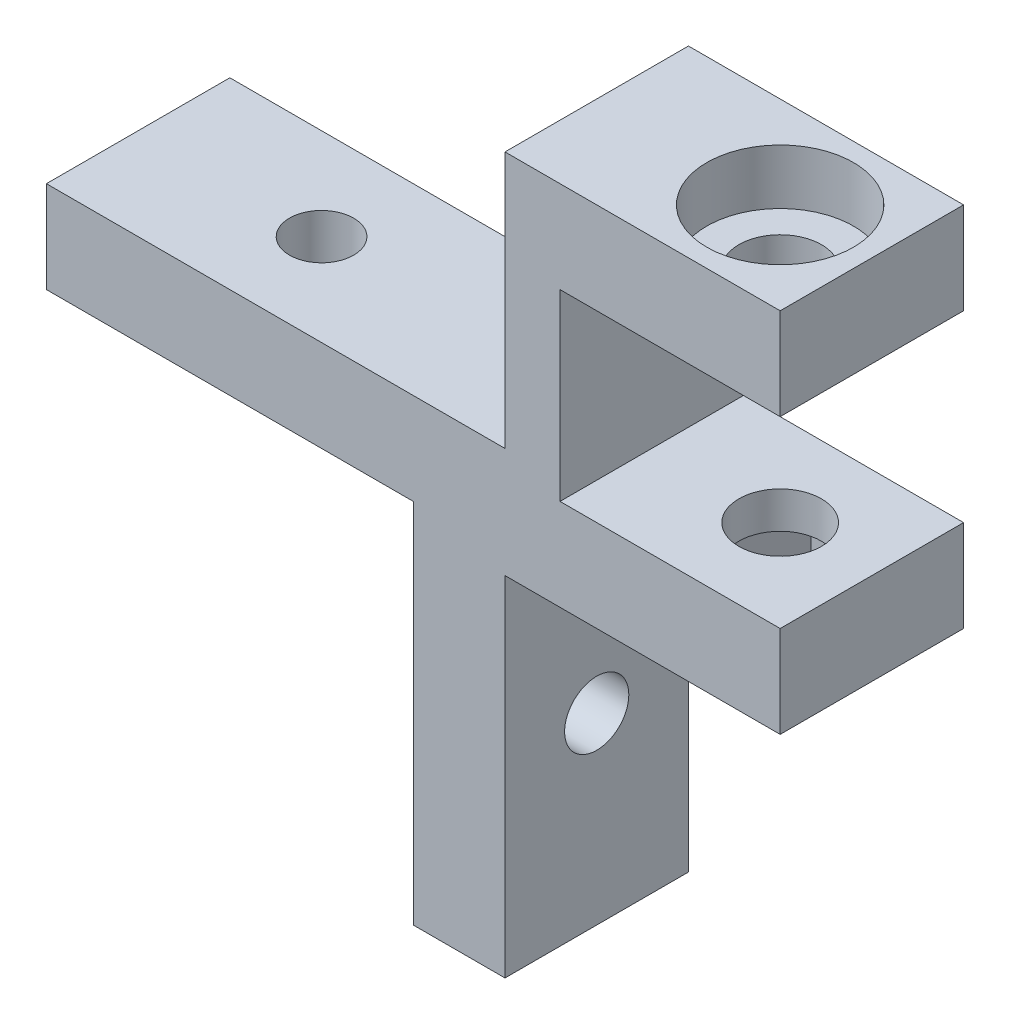
ISO-10303-21;
HEADER;
FILE_DESCRIPTION(('STEP AP214'),'2;1');
FILE_NAME('part.step','',(''),(''),'','','');
FILE_SCHEMA(('AUTOMOTIVE_DESIGN { 1 0 10303 214 1 1 1 1 }'));
ENDSEC;
DATA;
#1=APPLICATION_CONTEXT('core data for automotive mechanical design processes');
#2=APPLICATION_PROTOCOL_DEFINITION('international standard','automotive_design',2000,#1);
#3=PRODUCT_CONTEXT('',#1,'mechanical');
#4=PRODUCT('Part','Part','',(#3));
#5=PRODUCT_RELATED_PRODUCT_CATEGORY('part','',(#4));
#6=PRODUCT_DEFINITION_FORMATION('','',#4);
#7=PRODUCT_DEFINITION_CONTEXT('part definition',#1,'design');
#8=PRODUCT_DEFINITION('design','',#6,#7);
#9=PRODUCT_DEFINITION_SHAPE('','',#8);
#10=(LENGTH_UNIT() NAMED_UNIT(*) SI_UNIT(.MILLI.,.METRE.));
#11=(NAMED_UNIT(*) PLANE_ANGLE_UNIT() SI_UNIT($,.RADIAN.));
#12=(NAMED_UNIT(*) SI_UNIT($,.STERADIAN.) SOLID_ANGLE_UNIT());
#13=UNCERTAINTY_MEASURE_WITH_UNIT(LENGTH_MEASURE(1.E-05),#10,'distance_accuracy_value','');
#14=(GEOMETRIC_REPRESENTATION_CONTEXT(3) GLOBAL_UNCERTAINTY_ASSIGNED_CONTEXT((#13)) GLOBAL_UNIT_ASSIGNED_CONTEXT((#10,
#11,#12)) REPRESENTATION_CONTEXT('',''));
#15=CARTESIAN_POINT('',(0.,0.,0.));
#16=DIRECTION('',(0.,0.,1.));
#17=DIRECTION('',(1.,0.,0.));
#18=AXIS2_PLACEMENT_3D('',#15,#16,#17);
#19=CARTESIAN_POINT('',(22.5,-12.5,4.99999999999999));
#20=DIRECTION('',(0.,1.,0.));
#21=DIRECTION('',(0.,0.,1.));
#22=AXIS2_PLACEMENT_3D('',#19,#20,#21);
#23=CYLINDRICAL_SURFACE('',#22,2.25);
#24=CARTESIAN_POINT('',(22.5,11.5,4.99999999999999));
#25=DIRECTION('',(0.,-1.,0.));
#26=DIRECTION('',(1.,0.,0.));
#27=AXIS2_PLACEMENT_3D('',#24,#25,#26);
#28=CIRCLE('',#27,2.25);
#29=CARTESIAN_POINT('',(24.75,11.5,4.99999999999999));
#30=VERTEX_POINT('',#29);
#31=EDGE_CURVE('E243',#30,#30,#28,.T.);
#32=ORIENTED_EDGE('',*,*,#31,.F.);
#33=EDGE_LOOP('',(#32));
#34=FACE_BOUND('',#33,.T.);
#35=CARTESIAN_POINT('',(22.5,9.5,4.99999999999999));
#36=DIRECTION('',(0.,-1.,0.));
#37=DIRECTION('',(0.,0.,-1.));
#38=AXIS2_PLACEMENT_3D('',#35,#36,#37);
#39=CIRCLE('',#38,2.25);
#40=CARTESIAN_POINT('',(22.5,9.5,2.74999999999999));
#41=VERTEX_POINT('',#40);
#42=EDGE_CURVE('E36',#41,#41,#39,.F.);
#43=ORIENTED_EDGE('',*,*,#42,.F.);
#44=EDGE_LOOP('',(#43));
#45=FACE_BOUND('',#44,.T.);
#46=ADVANCED_FACE('F32',(#34,#45),#23,.F.);
#47=CARTESIAN_POINT('',(27.5,0.,0.));
#48=DIRECTION('',(-1.,0.,0.));
#49=DIRECTION('',(0.,0.,1.));
#50=AXIS2_PLACEMENT_3D('',#47,#48,#49);
#51=PLANE('',#50);
#52=DIRECTION('',(0.,1.,0.));
#53=VECTOR('',#52,1.);
#54=CARTESIAN_POINT('',(27.5,6.5,0.));
#55=LINE('',#54,#53);
#56=CARTESIAN_POINT('',(27.5,6.5,0.));
#57=VERTEX_POINT('',#56);
#58=CARTESIAN_POINT('',(27.5,11.5,0.));
#59=VERTEX_POINT('',#58);
#60=EDGE_CURVE('E279',#57,#59,#55,.T.);
#61=ORIENTED_EDGE('',*,*,#60,.T.);
#62=DIRECTION('',(0.,0.,1.));
#63=VECTOR('',#62,1.);
#64=CARTESIAN_POINT('',(27.5,11.5,0.));
#65=LINE('',#64,#63);
#66=CARTESIAN_POINT('',(27.5,11.5,10.));
#67=VERTEX_POINT('',#66);
#68=EDGE_CURVE('E263',#59,#67,#65,.T.);
#69=ORIENTED_EDGE('',*,*,#68,.T.);
#70=DIRECTION('',(0.,-1.,0.));
#71=VECTOR('',#70,1.);
#72=CARTESIAN_POINT('',(27.5,6.5,10.));
#73=LINE('',#72,#71);
#74=CARTESIAN_POINT('',(27.5,6.5,10.));
#75=VERTEX_POINT('',#74);
#76=EDGE_CURVE('E276',#67,#75,#73,.T.);
#77=ORIENTED_EDGE('',*,*,#76,.T.);
#78=DIRECTION('',(0.,0.,-1.));
#79=VECTOR('',#78,1.);
#80=CARTESIAN_POINT('',(27.5,6.5,10.));
#81=LINE('',#80,#79);
#82=EDGE_CURVE('E275',#75,#57,#81,.T.);
#83=ORIENTED_EDGE('',*,*,#82,.T.);
#84=EDGE_LOOP('',(#61,#69,#77,#83));
#85=FACE_BOUND('',#84,.T.);
#86=ADVANCED_FACE('F373',(#85),#51,.F.);
#87=CARTESIAN_POINT('',(12.5,-12.5,10.));
#88=DIRECTION('',(-1.,0.,0.));
#89=DIRECTION('',(0.,0.,1.));
#90=AXIS2_PLACEMENT_3D('',#87,#88,#89);
#91=PLANE('',#90);
#92=CARTESIAN_POINT('',(12.5,-2.5,5.));
#93=DIRECTION('',(1.,0.,0.));
#94=DIRECTION('',(0.,0.,-1.));
#95=AXIS2_PLACEMENT_3D('',#92,#93,#94);
#96=CIRCLE('',#95,1.75);
#97=CARTESIAN_POINT('',(12.5,-2.5,3.25));
#98=VERTEX_POINT('',#97);
#99=EDGE_CURVE('E235',#98,#98,#96,.T.);
#100=ORIENTED_EDGE('',*,*,#99,.F.);
#101=EDGE_LOOP('',(#100));
#102=FACE_BOUND('',#101,.T.);
#103=DIRECTION('',(0.,0.,-1.));
#104=VECTOR('',#103,1.);
#105=CARTESIAN_POINT('',(12.5,6.5,10.));
#106=LINE('',#105,#104);
#107=CARTESIAN_POINT('',(12.5,6.5,10.));
#108=VERTEX_POINT('',#107);
#109=CARTESIAN_POINT('',(12.5,6.5,0.));
#110=VERTEX_POINT('',#109);
#111=EDGE_CURVE('E287',#108,#110,#106,.T.);
#112=ORIENTED_EDGE('',*,*,#111,.F.);
#113=DIRECTION('',(0.,1.,0.));
#114=VECTOR('',#113,1.);
#115=CARTESIAN_POINT('',(12.5,-12.5,10.));
#116=LINE('',#115,#114);
#117=CARTESIAN_POINT('',(12.5,-12.5,10.));
#118=VERTEX_POINT('',#117);
#119=EDGE_CURVE('E324',#118,#108,#116,.T.);
#120=ORIENTED_EDGE('',*,*,#119,.F.);
#121=DIRECTION('',(0.,0.,-1.));
#122=VECTOR('',#121,1.);
#123=CARTESIAN_POINT('',(12.5,-12.5,10.));
#124=LINE('',#123,#122);
#125=CARTESIAN_POINT('',(12.5,-12.5,0.));
#126=VERTEX_POINT('',#125);
#127=EDGE_CURVE('E335',#118,#126,#124,.T.);
#128=ORIENTED_EDGE('',*,*,#127,.T.);
#129=DIRECTION('',(0.,1.,0.));
#130=VECTOR('',#129,1.);
#131=CARTESIAN_POINT('',(12.5,-12.5,0.));
#132=LINE('',#131,#130);
#133=EDGE_CURVE('E320',#126,#110,#132,.T.);
#134=ORIENTED_EDGE('',*,*,#133,.T.);
#135=EDGE_LOOP('',(#112,#120,#128,#134));
#136=FACE_BOUND('',#135,.T.);
#137=ADVANCED_FACE('F34',(#102,#136),#91,.F.);
#138=CARTESIAN_POINT('',(-12.5,12.5,10.));
#139=DIRECTION('',(0.,-1.,0.));
#140=DIRECTION('',(0.,0.,-1.));
#141=AXIS2_PLACEMENT_3D('',#138,#139,#140);
#142=PLANE('',#141);
#143=CARTESIAN_POINT('',(-2.5,12.5,5.));
#144=DIRECTION('',(0.,1.,0.));
#145=DIRECTION('',(0.,0.,1.));
#146=AXIS2_PLACEMENT_3D('',#143,#144,#145);
#147=CIRCLE('',#146,1.75);
#148=CARTESIAN_POINT('',(-2.5,12.5,6.75));
#149=VERTEX_POINT('',#148);
#150=EDGE_CURVE('E239',#149,#149,#147,.T.);
#151=ORIENTED_EDGE('',*,*,#150,.F.);
#152=EDGE_LOOP('',(#151));
#153=FACE_BOUND('',#152,.T.);
#154=DIRECTION('',(-1.,0.,0.));
#155=VECTOR('',#154,1.);
#156=CARTESIAN_POINT('',(-12.5,12.5,0.));
#157=LINE('',#156,#155);
#158=CARTESIAN_POINT('',(12.5,12.5,0.));
#159=VERTEX_POINT('',#158);
#160=CARTESIAN_POINT('',(-12.5,12.5,0.));
#161=VERTEX_POINT('',#160);
#162=EDGE_CURVE('E337',#159,#161,#157,.T.);
#163=ORIENTED_EDGE('',*,*,#162,.T.);
#164=DIRECTION('',(0.,0.,-1.));
#165=VECTOR('',#164,1.);
#166=CARTESIAN_POINT('',(-12.5,12.5,10.));
#167=LINE('',#166,#165);
#168=CARTESIAN_POINT('',(-12.5,12.5,10.));
#169=VERTEX_POINT('',#168);
#170=EDGE_CURVE('E41',#169,#161,#167,.T.);
#171=ORIENTED_EDGE('',*,*,#170,.F.);
#172=DIRECTION('',(-1.,0.,0.));
#173=VECTOR('',#172,1.);
#174=CARTESIAN_POINT('',(-12.5,12.5,10.));
#175=LINE('',#174,#173);
#176=CARTESIAN_POINT('',(12.5,12.5,10.));
#177=VERTEX_POINT('',#176);
#178=EDGE_CURVE('E327',#177,#169,#175,.T.);
#179=ORIENTED_EDGE('',*,*,#178,.F.);
#180=DIRECTION('',(0.,0.,-1.));
#181=VECTOR('',#180,1.);
#182=CARTESIAN_POINT('',(12.5,12.5,10.));
#183=LINE('',#182,#181);
#184=EDGE_CURVE('E11',#177,#159,#183,.T.);
#185=ORIENTED_EDGE('',*,*,#184,.T.);
#186=EDGE_LOOP('',(#163,#171,#179,#185));
#187=FACE_BOUND('',#186,.T.);
#188=ADVANCED_FACE('F422',(#153,#187),#142,.F.);
#189=CARTESIAN_POINT('',(-12.5,-12.5,10.));
#190=DIRECTION('',(1.,0.,0.));
#191=DIRECTION('',(0.,0.,-1.));
#192=AXIS2_PLACEMENT_3D('',#189,#190,#191);
#193=PLANE('',#192);
#194=DIRECTION('',(0.,-1.,0.));
#195=VECTOR('',#194,1.);
#196=CARTESIAN_POINT('',(-12.5,-12.5,0.));
#197=LINE('',#196,#195);
#198=CARTESIAN_POINT('',(-12.5,7.5,0.));
#199=VERTEX_POINT('',#198);
#200=EDGE_CURVE('E339',#161,#199,#197,.T.);
#201=ORIENTED_EDGE('',*,*,#200,.T.);
#202=DIRECTION('',(0.,0.,1.));
#203=VECTOR('',#202,1.);
#204=CARTESIAN_POINT('',(-12.5,7.5,0.));
#205=LINE('',#204,#203);
#206=CARTESIAN_POINT('',(-12.5,7.5,10.));
#207=VERTEX_POINT('',#206);
#208=EDGE_CURVE('E317',#199,#207,#205,.T.);
#209=ORIENTED_EDGE('',*,*,#208,.T.);
#210=DIRECTION('',(0.,-1.,0.));
#211=VECTOR('',#210,1.);
#212=CARTESIAN_POINT('',(-12.5,-12.5,10.));
#213=LINE('',#212,#211);
#214=EDGE_CURVE('E330',#169,#207,#213,.T.);
#215=ORIENTED_EDGE('',*,*,#214,.F.);
#216=ORIENTED_EDGE('',*,*,#170,.T.);
#217=EDGE_LOOP('',(#201,#209,#215,#216));
#218=FACE_BOUND('',#217,.T.);
#219=ADVANCED_FACE('F428',(#218),#193,.F.);
#220=CARTESIAN_POINT('',(-12.5,-12.5,10.));
#221=DIRECTION('',(0.,1.,0.));
#222=DIRECTION('',(0.,0.,1.));
#223=AXIS2_PLACEMENT_3D('',#220,#221,#222);
#224=PLANE('',#223);
#225=DIRECTION('',(1.,0.,0.));
#226=VECTOR('',#225,1.);
#227=CARTESIAN_POINT('',(-12.5,-12.5,10.));
#228=LINE('',#227,#226);
#229=CARTESIAN_POINT('',(7.5,-12.5,10.));
#230=VERTEX_POINT('',#229);
#231=EDGE_CURVE('E333',#230,#118,#228,.T.);
#232=ORIENTED_EDGE('',*,*,#231,.F.);
#233=DIRECTION('',(0.,0.,1.));
#234=VECTOR('',#233,1.);
#235=CARTESIAN_POINT('',(7.5,-12.5,0.));
#236=LINE('',#235,#234);
#237=CARTESIAN_POINT('',(7.5,-12.5,0.));
#238=VERTEX_POINT('',#237);
#239=EDGE_CURVE('E313',#238,#230,#236,.T.);
#240=ORIENTED_EDGE('',*,*,#239,.F.);
#241=DIRECTION('',(1.,0.,0.));
#242=VECTOR('',#241,1.);
#243=CARTESIAN_POINT('',(-12.5,-12.5,0.));
#244=LINE('',#243,#242);
#245=EDGE_CURVE('E328',#238,#126,#244,.T.);
#246=ORIENTED_EDGE('',*,*,#245,.T.);
#247=ORIENTED_EDGE('',*,*,#127,.F.);
#248=EDGE_LOOP('',(#232,#240,#246,#247));
#249=FACE_BOUND('',#248,.T.);
#250=ADVANCED_FACE('F438',(#249),#224,.F.);
#251=CARTESIAN_POINT('',(0.,0.,10.));
#252=DIRECTION('',(0.,0.,-1.));
#253=DIRECTION('',(-1.,0.,0.));
#254=AXIS2_PLACEMENT_3D('',#251,#252,#253);
#255=PLANE('',#254);
#256=ORIENTED_EDGE('',*,*,#76,.F.);
#257=DIRECTION('',(1.,0.,0.));
#258=VECTOR('',#257,1.);
#259=CARTESIAN_POINT('',(27.5,11.5,10.));
#260=LINE('',#259,#258);
#261=CARTESIAN_POINT('',(15.5,11.5,10.));
#262=VERTEX_POINT('',#261);
#263=EDGE_CURVE('E250',#262,#67,#260,.T.);
#264=ORIENTED_EDGE('',*,*,#263,.F.);
#265=DIRECTION('',(0.,-1.,0.));
#266=VECTOR('',#265,1.);
#267=CARTESIAN_POINT('',(15.5,21.5,10.));
#268=LINE('',#267,#266);
#269=CARTESIAN_POINT('',(15.5,21.5,10.));
#270=VERTEX_POINT('',#269);
#271=EDGE_CURVE('E259',#270,#262,#268,.T.);
#272=ORIENTED_EDGE('',*,*,#271,.F.);
#273=DIRECTION('',(-1.,0.,0.));
#274=VECTOR('',#273,1.);
#275=CARTESIAN_POINT('',(27.5,21.5,10.));
#276=LINE('',#275,#274);
#277=CARTESIAN_POINT('',(27.5,21.5,10.));
#278=VERTEX_POINT('',#277);
#279=EDGE_CURVE('E246',#278,#270,#276,.T.);
#280=ORIENTED_EDGE('',*,*,#279,.F.);
#281=CARTESIAN_POINT('',(27.5,26.5,10.));
#282=VERTEX_POINT('',#281);
#283=EDGE_CURVE('E272',#282,#278,#73,.T.);
#284=ORIENTED_EDGE('',*,*,#283,.F.);
#285=DIRECTION('',(-1.,0.,0.));
#286=VECTOR('',#285,1.);
#287=CARTESIAN_POINT('',(27.5,26.5,10.));
#288=LINE('',#287,#286);
#289=CARTESIAN_POINT('',(12.5,26.5,10.));
#290=VERTEX_POINT('',#289);
#291=EDGE_CURVE('E284',#282,#290,#288,.T.);
#292=ORIENTED_EDGE('',*,*,#291,.T.);
#293=DIRECTION('',(0.,-1.,0.));
#294=VECTOR('',#293,1.);
#295=CARTESIAN_POINT('',(12.5,6.5,10.));
#296=LINE('',#295,#294);
#297=EDGE_CURVE('E266',#290,#177,#296,.T.);
#298=ORIENTED_EDGE('',*,*,#297,.T.);
#299=ORIENTED_EDGE('',*,*,#178,.T.);
#300=ORIENTED_EDGE('',*,*,#214,.T.);
#301=DIRECTION('',(-1.,0.,0.));
#302=VECTOR('',#301,1.);
#303=CARTESIAN_POINT('',(-12.5,7.5,10.));
#304=LINE('',#303,#302);
#305=CARTESIAN_POINT('',(7.5,7.5,10.));
#306=VERTEX_POINT('',#305);
#307=EDGE_CURVE('E310',#306,#207,#304,.T.);
#308=ORIENTED_EDGE('',*,*,#307,.F.);
#309=DIRECTION('',(0.,1.,0.));
#310=VECTOR('',#309,1.);
#311=CARTESIAN_POINT('',(7.5,-12.5,10.));
#312=LINE('',#311,#310);
#313=EDGE_CURVE('E305',#230,#306,#312,.T.);
#314=ORIENTED_EDGE('',*,*,#313,.F.);
#315=ORIENTED_EDGE('',*,*,#231,.T.);
#316=ORIENTED_EDGE('',*,*,#119,.T.);
#317=DIRECTION('',(-1.,0.,0.));
#318=VECTOR('',#317,1.);
#319=CARTESIAN_POINT('',(27.5,6.5,10.));
#320=LINE('',#319,#318);
#321=EDGE_CURVE('E302',#75,#108,#320,.T.);
#322=ORIENTED_EDGE('',*,*,#321,.F.);
#323=EDGE_LOOP('',(#256,#264,#272,#280,#284,#292,#298,#299,#300,#308,#314,#315,#316,#322));
#324=FACE_BOUND('',#323,.T.);
#325=ADVANCED_FACE('F404',(#324),#255,.F.);
#326=CARTESIAN_POINT('',(0.,0.,0.));
#327=DIRECTION('',(0.,0.,-1.));
#328=DIRECTION('',(-1.,0.,0.));
#329=AXIS2_PLACEMENT_3D('',#326,#327,#328);
#330=PLANE('',#329);
#331=DIRECTION('',(1.,0.,0.));
#332=VECTOR('',#331,1.);
#333=CARTESIAN_POINT('',(27.5,11.5,0.));
#334=LINE('',#333,#332);
#335=CARTESIAN_POINT('',(15.5,11.5,0.));
#336=VERTEX_POINT('',#335);
#337=EDGE_CURVE('E253',#336,#59,#334,.T.);
#338=ORIENTED_EDGE('',*,*,#337,.T.);
#339=ORIENTED_EDGE('',*,*,#60,.F.);
#340=DIRECTION('',(-1.,0.,0.));
#341=VECTOR('',#340,1.);
#342=CARTESIAN_POINT('',(27.5,6.5,0.));
#343=LINE('',#342,#341);
#344=EDGE_CURVE('E299',#57,#110,#343,.T.);
#345=ORIENTED_EDGE('',*,*,#344,.T.);
#346=ORIENTED_EDGE('',*,*,#133,.F.);
#347=ORIENTED_EDGE('',*,*,#245,.F.);
#348=DIRECTION('',(0.,1.,0.));
#349=VECTOR('',#348,1.);
#350=CARTESIAN_POINT('',(7.5,-12.5,0.));
#351=LINE('',#350,#349);
#352=CARTESIAN_POINT('',(7.5,7.5,0.));
#353=VERTEX_POINT('',#352);
#354=EDGE_CURVE('E306',#238,#353,#351,.T.);
#355=ORIENTED_EDGE('',*,*,#354,.T.);
#356=DIRECTION('',(-1.,0.,0.));
#357=VECTOR('',#356,1.);
#358=CARTESIAN_POINT('',(-12.5,7.5,0.));
#359=LINE('',#358,#357);
#360=EDGE_CURVE('E309',#353,#199,#359,.T.);
#361=ORIENTED_EDGE('',*,*,#360,.T.);
#362=ORIENTED_EDGE('',*,*,#200,.F.);
#363=ORIENTED_EDGE('',*,*,#162,.F.);
#364=DIRECTION('',(0.,1.,0.));
#365=VECTOR('',#364,1.);
#366=CARTESIAN_POINT('',(12.5,6.5,0.));
#367=LINE('',#366,#365);
#368=CARTESIAN_POINT('',(12.5,26.5,0.));
#369=VERTEX_POINT('',#368);
#370=EDGE_CURVE('E290',#159,#369,#367,.T.);
#371=ORIENTED_EDGE('',*,*,#370,.T.);
#372=DIRECTION('',(-1.,0.,0.));
#373=VECTOR('',#372,1.);
#374=CARTESIAN_POINT('',(27.5,26.5,0.));
#375=LINE('',#374,#373);
#376=CARTESIAN_POINT('',(27.5,26.5,0.));
#377=VERTEX_POINT('',#376);
#378=EDGE_CURVE('E296',#377,#369,#375,.T.);
#379=ORIENTED_EDGE('',*,*,#378,.F.);
#380=CARTESIAN_POINT('',(27.5,21.5,0.));
#381=VERTEX_POINT('',#380);
#382=EDGE_CURVE('E278',#381,#377,#55,.T.);
#383=ORIENTED_EDGE('',*,*,#382,.F.);
#384=DIRECTION('',(-1.,0.,0.));
#385=VECTOR('',#384,1.);
#386=CARTESIAN_POINT('',(27.5,21.5,0.));
#387=LINE('',#386,#385);
#388=CARTESIAN_POINT('',(15.5,21.5,0.));
#389=VERTEX_POINT('',#388);
#390=EDGE_CURVE('E57',#381,#389,#387,.T.);
#391=ORIENTED_EDGE('',*,*,#390,.T.);
#392=DIRECTION('',(0.,-1.,0.));
#393=VECTOR('',#392,1.);
#394=CARTESIAN_POINT('',(15.5,21.5,0.));
#395=LINE('',#394,#393);
#396=EDGE_CURVE('E249',#389,#336,#395,.T.);
#397=ORIENTED_EDGE('',*,*,#396,.T.);
#398=EDGE_LOOP('',(#338,#339,#345,#346,#347,#355,#361,#362,#363,#371,#379,#383,#391,#397));
#399=FACE_BOUND('',#398,.T.);
#400=ADVANCED_FACE('F409',(#399),#330,.T.);
#401=CARTESIAN_POINT('',(-12.5,7.5,0.));
#402=DIRECTION('',(0.,1.,0.));
#403=DIRECTION('',(0.,0.,1.));
#404=AXIS2_PLACEMENT_3D('',#401,#402,#403);
#405=PLANE('',#404);
#406=CARTESIAN_POINT('',(-2.5,7.5,5.));
#407=DIRECTION('',(0.,1.,0.));
#408=DIRECTION('',(0.,0.,1.));
#409=AXIS2_PLACEMENT_3D('',#406,#407,#408);
#410=CIRCLE('',#409,1.75);
#411=CARTESIAN_POINT('',(-2.5,7.5,6.75));
#412=VERTEX_POINT('',#411);
#413=EDGE_CURVE('E242',#412,#412,#410,.T.);
#414=ORIENTED_EDGE('',*,*,#413,.T.);
#415=EDGE_LOOP('',(#414));
#416=FACE_BOUND('',#415,.T.);
#417=ORIENTED_EDGE('',*,*,#307,.T.);
#418=ORIENTED_EDGE('',*,*,#208,.F.);
#419=ORIENTED_EDGE('',*,*,#360,.F.);
#420=DIRECTION('',(0.,0.,1.));
#421=VECTOR('',#420,1.);
#422=CARTESIAN_POINT('',(7.5,7.5,0.));
#423=LINE('',#422,#421);
#424=EDGE_CURVE('E321',#353,#306,#423,.T.);
#425=ORIENTED_EDGE('',*,*,#424,.T.);
#426=EDGE_LOOP('',(#417,#418,#419,#425));
#427=FACE_BOUND('',#426,.T.);
#428=ADVANCED_FACE('F431',(#416,#427),#405,.F.);
#429=CARTESIAN_POINT('',(7.5,-12.5,0.));
#430=DIRECTION('',(1.,0.,0.));
#431=DIRECTION('',(0.,0.,-1.));
#432=AXIS2_PLACEMENT_3D('',#429,#430,#431);
#433=PLANE('',#432);
#434=CARTESIAN_POINT('',(7.5,-2.5,5.));
#435=DIRECTION('',(1.,0.,0.));
#436=DIRECTION('',(0.,0.,-1.));
#437=AXIS2_PLACEMENT_3D('',#434,#435,#436);
#438=CIRCLE('',#437,1.75);
#439=CARTESIAN_POINT('',(7.5,-2.5,3.25));
#440=VERTEX_POINT('',#439);
#441=EDGE_CURVE('E238',#440,#440,#438,.T.);
#442=ORIENTED_EDGE('',*,*,#441,.T.);
#443=EDGE_LOOP('',(#442));
#444=FACE_BOUND('',#443,.T.);
#445=ORIENTED_EDGE('',*,*,#313,.T.);
#446=ORIENTED_EDGE('',*,*,#424,.F.);
#447=ORIENTED_EDGE('',*,*,#354,.F.);
#448=ORIENTED_EDGE('',*,*,#239,.T.);
#449=EDGE_LOOP('',(#445,#446,#447,#448));
#450=FACE_BOUND('',#449,.T.);
#451=ADVANCED_FACE('F353',(#444,#450),#433,.F.);
#452=CARTESIAN_POINT('',(12.5,0.,0.));
#453=DIRECTION('',(-1.,0.,0.));
#454=DIRECTION('',(0.,0.,1.));
#455=AXIS2_PLACEMENT_3D('',#452,#453,#454);
#456=PLANE('',#455);
#457=ORIENTED_EDGE('',*,*,#184,.F.);
#458=ORIENTED_EDGE('',*,*,#297,.F.);
#459=DIRECTION('',(0.,0.,1.));
#460=VECTOR('',#459,1.);
#461=CARTESIAN_POINT('',(12.5,26.5,10.));
#462=LINE('',#461,#460);
#463=EDGE_CURVE('E292',#369,#290,#462,.T.);
#464=ORIENTED_EDGE('',*,*,#463,.F.);
#465=ORIENTED_EDGE('',*,*,#370,.F.);
#466=EDGE_LOOP('',(#457,#458,#464,#465));
#467=FACE_BOUND('',#466,.T.);
#468=ADVANCED_FACE('F419',(#467),#456,.T.);
#469=CARTESIAN_POINT('',(27.5,6.5,10.));
#470=DIRECTION('',(0.,1.,0.));
#471=DIRECTION('',(0.,0.,1.));
#472=AXIS2_PLACEMENT_3D('',#469,#470,#471);
#473=PLANE('',#472);
#474=DIRECTION('',(0.500000000000001,0.,-0.866025403784438));
#475=VECTOR('',#474,1.);
#476=CARTESIAN_POINT('',(17.881197846483,6.5,4.99999999999999));
#477=LINE('',#476,#475);
#478=CARTESIAN_POINT('',(17.881197846483,6.5,4.99999999999999));
#479=VERTEX_POINT('',#478);
#480=CARTESIAN_POINT('',(20.1905989232415,6.5,0.999999999999996));
#481=VERTEX_POINT('',#480);
#482=EDGE_CURVE('E207',#479,#481,#477,.T.);
#483=ORIENTED_EDGE('',*,*,#482,.F.);
#484=DIRECTION('',(-0.5,0.,-0.866025403784439));
#485=VECTOR('',#484,1.);
#486=CARTESIAN_POINT('',(20.1905989232415,6.5,8.99999999999999));
#487=LINE('',#486,#485);
#488=CARTESIAN_POINT('',(20.1905989232415,6.5,8.99999999999999));
#489=VERTEX_POINT('',#488);
#490=EDGE_CURVE('E49',#489,#479,#487,.T.);
#491=ORIENTED_EDGE('',*,*,#490,.F.);
#492=DIRECTION('',(-1.,0.,0.));
#493=VECTOR('',#492,1.);
#494=CARTESIAN_POINT('',(24.8094010767585,6.5,8.99999999999999));
#495=LINE('',#494,#493);
#496=CARTESIAN_POINT('',(24.8094010767585,6.5,8.99999999999999));
#497=VERTEX_POINT('',#496);
#498=EDGE_CURVE('E193',#497,#489,#495,.T.);
#499=ORIENTED_EDGE('',*,*,#498,.F.);
#500=DIRECTION('',(-0.5,0.,0.866025403784438));
#501=VECTOR('',#500,1.);
#502=CARTESIAN_POINT('',(27.118802153517,6.5,5.));
#503=LINE('',#502,#501);
#504=CARTESIAN_POINT('',(27.118802153517,6.5,5.));
#505=VERTEX_POINT('',#504);
#506=EDGE_CURVE('E196',#505,#497,#503,.T.);
#507=ORIENTED_EDGE('',*,*,#506,.F.);
#508=DIRECTION('',(0.5,0.,0.866025403784438));
#509=VECTOR('',#508,1.);
#510=CARTESIAN_POINT('',(24.8094010767585,6.5,0.999999999999997));
#511=LINE('',#510,#509);
#512=CARTESIAN_POINT('',(24.8094010767585,6.5,0.999999999999997));
#513=VERTEX_POINT('',#512);
#514=EDGE_CURVE('E212',#513,#505,#511,.T.);
#515=ORIENTED_EDGE('',*,*,#514,.F.);
#516=DIRECTION('',(1.,0.,0.));
#517=VECTOR('',#516,1.);
#518=CARTESIAN_POINT('',(20.1905989232415,6.5,0.999999999999996));
#519=LINE('',#518,#517);
#520=EDGE_CURVE('E209',#481,#513,#519,.T.);
#521=ORIENTED_EDGE('',*,*,#520,.F.);
#522=EDGE_LOOP('',(#483,#491,#499,#507,#515,#521));
#523=FACE_BOUND('',#522,.T.);
#524=ORIENTED_EDGE('',*,*,#111,.T.);
#525=ORIENTED_EDGE('',*,*,#344,.F.);
#526=ORIENTED_EDGE('',*,*,#82,.F.);
#527=ORIENTED_EDGE('',*,*,#321,.T.);
#528=EDGE_LOOP('',(#524,#525,#526,#527));
#529=FACE_BOUND('',#528,.T.);
#530=ADVANCED_FACE('F445',(#523,#529),#473,.F.);
#531=CARTESIAN_POINT('',(27.5,26.5,10.));
#532=DIRECTION('',(0.,-1.,0.));
#533=DIRECTION('',(0.,0.,-1.));
#534=AXIS2_PLACEMENT_3D('',#531,#532,#533);
#535=PLANE('',#534);
#536=CARTESIAN_POINT('',(22.5,26.5,4.99999999999999));
#537=DIRECTION('',(0.,1.,0.));
#538=DIRECTION('',(0.,0.,1.));
#539=AXIS2_PLACEMENT_3D('',#536,#537,#538);
#540=CIRCLE('',#539,4.);
#541=CARTESIAN_POINT('',(22.5,26.5,8.99999999999999));
#542=VERTEX_POINT('',#541);
#543=EDGE_CURVE('E226',#542,#542,#540,.T.);
#544=ORIENTED_EDGE('',*,*,#543,.F.);
#545=EDGE_LOOP('',(#544));
#546=FACE_BOUND('',#545,.T.);
#547=ORIENTED_EDGE('',*,*,#463,.T.);
#548=ORIENTED_EDGE('',*,*,#291,.F.);
#549=DIRECTION('',(0.,0.,1.));
#550=VECTOR('',#549,1.);
#551=CARTESIAN_POINT('',(27.5,26.5,10.));
#552=LINE('',#551,#550);
#553=EDGE_CURVE('E282',#377,#282,#552,.T.);
#554=ORIENTED_EDGE('',*,*,#553,.F.);
#555=ORIENTED_EDGE('',*,*,#378,.T.);
#556=EDGE_LOOP('',(#547,#548,#554,#555));
#557=FACE_BOUND('',#556,.T.);
#558=ADVANCED_FACE('F476',(#546,#557),#535,.F.);
#559=ORIENTED_EDGE('',*,*,#283,.T.);
#560=DIRECTION('',(0.,0.,1.));
#561=VECTOR('',#560,1.);
#562=CARTESIAN_POINT('',(27.5,21.5,0.));
#563=LINE('',#562,#561);
#564=EDGE_CURVE('E256',#381,#278,#563,.T.);
#565=ORIENTED_EDGE('',*,*,#564,.F.);
#566=ORIENTED_EDGE('',*,*,#382,.T.);
#567=ORIENTED_EDGE('',*,*,#553,.T.);
#568=EDGE_LOOP('',(#559,#565,#566,#567));
#569=FACE_BOUND('',#568,.T.);
#570=ADVANCED_FACE('F381',(#569),#51,.F.);
#571=CARTESIAN_POINT('',(27.5,11.5,0.));
#572=DIRECTION('',(0.,-1.,0.));
#573=DIRECTION('',(1.,0.,0.));
#574=AXIS2_PLACEMENT_3D('',#571,#572,#573);
#575=PLANE('',#574);
#576=ORIENTED_EDGE('',*,*,#31,.T.);
#577=EDGE_LOOP('',(#576));
#578=FACE_BOUND('',#577,.T.);
#579=ORIENTED_EDGE('',*,*,#263,.T.);
#580=ORIENTED_EDGE('',*,*,#68,.F.);
#581=ORIENTED_EDGE('',*,*,#337,.F.);
#582=DIRECTION('',(0.,0.,1.));
#583=VECTOR('',#582,1.);
#584=CARTESIAN_POINT('',(15.5,11.5,0.));
#585=LINE('',#584,#583);
#586=EDGE_CURVE('E267',#336,#262,#585,.T.);
#587=ORIENTED_EDGE('',*,*,#586,.T.);
#588=EDGE_LOOP('',(#579,#580,#581,#587));
#589=FACE_BOUND('',#588,.T.);
#590=ADVANCED_FACE('F449',(#578,#589),#575,.F.);
#591=CARTESIAN_POINT('',(15.5,21.5,0.));
#592=DIRECTION('',(-1.,0.,0.));
#593=DIRECTION('',(0.,0.,1.));
#594=AXIS2_PLACEMENT_3D('',#591,#592,#593);
#595=PLANE('',#594);
#596=ORIENTED_EDGE('',*,*,#271,.T.);
#597=ORIENTED_EDGE('',*,*,#586,.F.);
#598=ORIENTED_EDGE('',*,*,#396,.F.);
#599=DIRECTION('',(0.,0.,1.));
#600=VECTOR('',#599,1.);
#601=CARTESIAN_POINT('',(15.5,21.5,0.));
#602=LINE('',#601,#600);
#603=EDGE_CURVE('E269',#389,#270,#602,.T.);
#604=ORIENTED_EDGE('',*,*,#603,.T.);
#605=EDGE_LOOP('',(#596,#597,#598,#604));
#606=FACE_BOUND('',#605,.T.);
#607=ADVANCED_FACE('F391',(#606),#595,.F.);
#608=CARTESIAN_POINT('',(27.5,21.5,0.));
#609=DIRECTION('',(0.,1.,0.));
#610=DIRECTION('',(0.,0.,1.));
#611=AXIS2_PLACEMENT_3D('',#608,#609,#610);
#612=PLANE('',#611);
#613=CARTESIAN_POINT('',(22.5,21.5,4.99999999999999));
#614=DIRECTION('',(0.,1.,0.));
#615=DIRECTION('',(0.,0.,1.));
#616=AXIS2_PLACEMENT_3D('',#613,#614,#615);
#617=CIRCLE('',#616,2.25);
#618=CARTESIAN_POINT('',(22.5,21.5,7.24999999999999));
#619=VERTEX_POINT('',#618);
#620=EDGE_CURVE('E247',#619,#619,#617,.T.);
#621=ORIENTED_EDGE('',*,*,#620,.T.);
#622=EDGE_LOOP('',(#621));
#623=FACE_BOUND('',#622,.T.);
#624=ORIENTED_EDGE('',*,*,#279,.T.);
#625=ORIENTED_EDGE('',*,*,#603,.F.);
#626=ORIENTED_EDGE('',*,*,#390,.F.);
#627=ORIENTED_EDGE('',*,*,#564,.T.);
#628=EDGE_LOOP('',(#624,#625,#626,#627));
#629=FACE_BOUND('',#628,.T.);
#630=ADVANCED_FACE('F386',(#623,#629),#612,.F.);
#631=CARTESIAN_POINT('',(22.5,23.5,4.99999999999999));
#632=DIRECTION('',(0.,1.,0.));
#633=DIRECTION('',(0.,0.,1.));
#634=AXIS2_PLACEMENT_3D('',#631,#632,#633);
#635=CIRCLE('',#634,2.25);
#636=CARTESIAN_POINT('',(22.5,23.5,7.24999999999999));
#637=VERTEX_POINT('',#636);
#638=EDGE_CURVE('E232',#637,#637,#635,.T.);
#639=ORIENTED_EDGE('',*,*,#638,.T.);
#640=EDGE_LOOP('',(#639));
#641=FACE_BOUND('',#640,.T.);
#642=ORIENTED_EDGE('',*,*,#620,.F.);
#643=EDGE_LOOP('',(#642));
#644=FACE_BOUND('',#643,.T.);
#645=ADVANCED_FACE('F369',(#641,#644),#23,.F.);
#646=CARTESIAN_POINT('',(-2.5,-2.5,5.));
#647=DIRECTION('',(0.,1.,0.));
#648=DIRECTION('',(0.,0.,1.));
#649=AXIS2_PLACEMENT_3D('',#646,#647,#648);
#650=CYLINDRICAL_SURFACE('',#649,1.75);
#651=ORIENTED_EDGE('',*,*,#150,.T.);
#652=EDGE_LOOP('',(#651));
#653=FACE_BOUND('',#652,.T.);
#654=ORIENTED_EDGE('',*,*,#413,.F.);
#655=EDGE_LOOP('',(#654));
#656=FACE_BOUND('',#655,.T.);
#657=ADVANCED_FACE('F359',(#653,#656),#650,.F.);
#658=CARTESIAN_POINT('',(-2.5,-2.5,5.));
#659=DIRECTION('',(1.,0.,0.));
#660=DIRECTION('',(0.,0.,-1.));
#661=AXIS2_PLACEMENT_3D('',#658,#659,#660);
#662=CYLINDRICAL_SURFACE('',#661,1.75);
#663=ORIENTED_EDGE('',*,*,#99,.T.);
#664=EDGE_LOOP('',(#663));
#665=FACE_BOUND('',#664,.T.);
#666=ORIENTED_EDGE('',*,*,#441,.F.);
#667=EDGE_LOOP('',(#666));
#668=FACE_BOUND('',#667,.T.);
#669=ADVANCED_FACE('F356',(#665,#668),#662,.F.);
#670=CARTESIAN_POINT('',(24.75,23.5,4.99999999999999));
#671=DIRECTION('',(0.,-1.,0.));
#672=DIRECTION('',(0.,0.,-1.));
#673=AXIS2_PLACEMENT_3D('',#670,#671,#672);
#674=PLANE('',#673);
#675=ORIENTED_EDGE('',*,*,#638,.F.);
#676=EDGE_LOOP('',(#675));
#677=FACE_BOUND('',#676,.T.);
#678=CARTESIAN_POINT('',(22.5,23.5,4.99999999999999));
#679=DIRECTION('',(0.,1.,0.));
#680=DIRECTION('',(0.,0.,1.));
#681=AXIS2_PLACEMENT_3D('',#678,#679,#680);
#682=CIRCLE('',#681,4.);
#683=CARTESIAN_POINT('',(22.5,23.5,8.99999999999999));
#684=VERTEX_POINT('',#683);
#685=EDGE_CURVE('E229',#684,#684,#682,.T.);
#686=ORIENTED_EDGE('',*,*,#685,.T.);
#687=EDGE_LOOP('',(#686));
#688=FACE_BOUND('',#687,.T.);
#689=ADVANCED_FACE('F358',(#677,#688),#674,.F.);
#690=CARTESIAN_POINT('',(22.5,26.5,4.99999999999999));
#691=DIRECTION('',(0.,1.,0.));
#692=DIRECTION('',(0.,0.,1.));
#693=AXIS2_PLACEMENT_3D('',#690,#691,#692);
#694=CYLINDRICAL_SURFACE('',#693,4.);
#695=ORIENTED_EDGE('',*,*,#685,.F.);
#696=EDGE_LOOP('',(#695));
#697=FACE_BOUND('',#696,.T.);
#698=ORIENTED_EDGE('',*,*,#543,.T.);
#699=EDGE_LOOP('',(#698));
#700=FACE_BOUND('',#699,.T.);
#701=ADVANCED_FACE('F366',(#697,#700),#694,.F.);
#702=CARTESIAN_POINT('',(0.,9.5,0.));
#703=DIRECTION('',(0.,-1.,0.));
#704=DIRECTION('',(0.,0.,-1.));
#705=AXIS2_PLACEMENT_3D('',#702,#703,#704);
#706=PLANE('',#705);
#707=DIRECTION('',(-0.5,0.,-0.866025403784439));
#708=VECTOR('',#707,1.);
#709=CARTESIAN_POINT('',(20.1905989232415,9.5,8.99999999999999));
#710=LINE('',#709,#708);
#711=CARTESIAN_POINT('',(20.1905989232415,9.5,8.99999999999999));
#712=VERTEX_POINT('',#711);
#713=CARTESIAN_POINT('',(17.881197846483,9.5,4.99999999999999));
#714=VERTEX_POINT('',#713);
#715=EDGE_CURVE('E173',#712,#714,#710,.T.);
#716=ORIENTED_EDGE('',*,*,#715,.T.);
#717=DIRECTION('',(0.500000000000001,0.,-0.866025403784438));
#718=VECTOR('',#717,1.);
#719=CARTESIAN_POINT('',(17.881197846483,9.5,4.99999999999999));
#720=LINE('',#719,#718);
#721=CARTESIAN_POINT('',(20.1905989232415,9.5,0.999999999999996));
#722=VERTEX_POINT('',#721);
#723=EDGE_CURVE('E182',#714,#722,#720,.T.);
#724=ORIENTED_EDGE('',*,*,#723,.T.);
#725=DIRECTION('',(1.,0.,0.));
#726=VECTOR('',#725,1.);
#727=CARTESIAN_POINT('',(20.1905989232415,9.5,0.999999999999996));
#728=LINE('',#727,#726);
#729=CARTESIAN_POINT('',(24.8094010767585,9.5,0.999999999999996));
#730=VERTEX_POINT('',#729);
#731=EDGE_CURVE('E187',#722,#730,#728,.T.);
#732=ORIENTED_EDGE('',*,*,#731,.T.);
#733=DIRECTION('',(0.5,0.,0.866025403784438));
#734=VECTOR('',#733,1.);
#735=CARTESIAN_POINT('',(24.8094010767585,9.5,0.999999999999996));
#736=LINE('',#735,#734);
#737=CARTESIAN_POINT('',(27.118802153517,9.5,5.));
#738=VERTEX_POINT('',#737);
#739=EDGE_CURVE('E200',#730,#738,#736,.T.);
#740=ORIENTED_EDGE('',*,*,#739,.T.);
#741=DIRECTION('',(-0.5,0.,0.866025403784438));
#742=VECTOR('',#741,1.);
#743=CARTESIAN_POINT('',(27.118802153517,9.5,5.));
#744=LINE('',#743,#742);
#745=CARTESIAN_POINT('',(24.8094010767585,9.5,8.99999999999999));
#746=VERTEX_POINT('',#745);
#747=EDGE_CURVE('E203',#738,#746,#744,.T.);
#748=ORIENTED_EDGE('',*,*,#747,.T.);
#749=DIRECTION('',(-1.,0.,0.));
#750=VECTOR('',#749,1.);
#751=CARTESIAN_POINT('',(24.8094010767585,9.5,8.99999999999999));
#752=LINE('',#751,#750);
#753=EDGE_CURVE('E179',#746,#712,#752,.T.);
#754=ORIENTED_EDGE('',*,*,#753,.T.);
#755=EDGE_LOOP('',(#716,#724,#732,#740,#748,#754));
#756=FACE_BOUND('',#755,.T.);
#757=ORIENTED_EDGE('',*,*,#42,.T.);
#758=EDGE_LOOP('',(#757));
#759=FACE_BOUND('',#758,.T.);
#760=ADVANCED_FACE('F189',(#756,#759),#706,.T.);
#761=CARTESIAN_POINT('',(20.1905989232415,9.5,8.99999999999999));
#762=DIRECTION('',(-0.866025403784439,0.,0.5));
#763=DIRECTION('',(0.5,0.,0.866025403784439));
#764=AXIS2_PLACEMENT_3D('',#761,#762,#763);
#765=PLANE('',#764);
#766=ORIENTED_EDGE('',*,*,#490,.T.);
#767=DIRECTION('',(0.,-1.,0.));
#768=VECTOR('',#767,1.);
#769=CARTESIAN_POINT('',(17.881197846483,9.5,4.99999999999999));
#770=LINE('',#769,#768);
#771=EDGE_CURVE('E169',#714,#479,#770,.T.);
#772=ORIENTED_EDGE('',*,*,#771,.F.);
#773=ORIENTED_EDGE('',*,*,#715,.F.);
#774=DIRECTION('',(0.,-1.,0.));
#775=VECTOR('',#774,1.);
#776=CARTESIAN_POINT('',(20.1905989232415,9.5,8.99999999999999));
#777=LINE('',#776,#775);
#778=EDGE_CURVE('E217',#712,#489,#777,.T.);
#779=ORIENTED_EDGE('',*,*,#778,.T.);
#780=EDGE_LOOP('',(#766,#772,#773,#779));
#781=FACE_BOUND('',#780,.T.);
#782=ADVANCED_FACE('F171',(#781),#765,.F.);
#783=CARTESIAN_POINT('',(24.8094010767585,9.5,8.99999999999999));
#784=DIRECTION('',(0.,0.,1.));
#785=DIRECTION('',(0.,-1.,0.));
#786=AXIS2_PLACEMENT_3D('',#783,#784,#785);
#787=PLANE('',#786);
#788=ORIENTED_EDGE('',*,*,#498,.T.);
#789=ORIENTED_EDGE('',*,*,#778,.F.);
#790=ORIENTED_EDGE('',*,*,#753,.F.);
#791=DIRECTION('',(0.,-1.,0.));
#792=VECTOR('',#791,1.);
#793=CARTESIAN_POINT('',(24.8094010767585,9.5,8.99999999999999));
#794=LINE('',#793,#792);
#795=EDGE_CURVE('E219',#746,#497,#794,.T.);
#796=ORIENTED_EDGE('',*,*,#795,.T.);
#797=EDGE_LOOP('',(#788,#789,#790,#796));
#798=FACE_BOUND('',#797,.T.);
#799=ADVANCED_FACE('F586',(#798),#787,.F.);
#800=CARTESIAN_POINT('',(27.118802153517,9.5,5.));
#801=DIRECTION('',(0.866025403784438,0.,0.5));
#802=DIRECTION('',(0.5,0.,-0.866025403784438));
#803=AXIS2_PLACEMENT_3D('',#800,#801,#802);
#804=PLANE('',#803);
#805=ORIENTED_EDGE('',*,*,#506,.T.);
#806=ORIENTED_EDGE('',*,*,#795,.F.);
#807=ORIENTED_EDGE('',*,*,#747,.F.);
#808=DIRECTION('',(0.,-1.,0.));
#809=VECTOR('',#808,1.);
#810=CARTESIAN_POINT('',(27.118802153517,9.5,5.));
#811=LINE('',#810,#809);
#812=EDGE_CURVE('E221',#738,#505,#811,.T.);
#813=ORIENTED_EDGE('',*,*,#812,.T.);
#814=EDGE_LOOP('',(#805,#806,#807,#813));
#815=FACE_BOUND('',#814,.T.);
#816=ADVANCED_FACE('F595',(#815),#804,.F.);
#817=CARTESIAN_POINT('',(24.8094010767585,9.5,0.999999999999996));
#818=DIRECTION('',(0.866025403784439,0.,-0.5));
#819=DIRECTION('',(-0.5,0.,-0.866025403784439));
#820=AXIS2_PLACEMENT_3D('',#817,#818,#819);
#821=PLANE('',#820);
#822=ORIENTED_EDGE('',*,*,#514,.T.);
#823=ORIENTED_EDGE('',*,*,#812,.F.);
#824=ORIENTED_EDGE('',*,*,#739,.F.);
#825=DIRECTION('',(0.,-1.,0.));
#826=VECTOR('',#825,1.);
#827=CARTESIAN_POINT('',(24.8094010767585,9.5,0.999999999999996));
#828=LINE('',#827,#826);
#829=EDGE_CURVE('E223',#730,#513,#828,.T.);
#830=ORIENTED_EDGE('',*,*,#829,.T.);
#831=EDGE_LOOP('',(#822,#823,#824,#830));
#832=FACE_BOUND('',#831,.T.);
#833=ADVANCED_FACE('F605',(#832),#821,.F.);
#834=CARTESIAN_POINT('',(20.1905989232415,9.5,0.999999999999996));
#835=DIRECTION('',(0.,0.,-1.));
#836=DIRECTION('',(0.,1.,0.));
#837=AXIS2_PLACEMENT_3D('',#834,#835,#836);
#838=PLANE('',#837);
#839=ORIENTED_EDGE('',*,*,#520,.T.);
#840=ORIENTED_EDGE('',*,*,#829,.F.);
#841=ORIENTED_EDGE('',*,*,#731,.F.);
#842=DIRECTION('',(0.,-1.,0.));
#843=VECTOR('',#842,1.);
#844=CARTESIAN_POINT('',(20.1905989232415,9.5,0.999999999999996));
#845=LINE('',#844,#843);
#846=EDGE_CURVE('E178',#722,#481,#845,.T.);
#847=ORIENTED_EDGE('',*,*,#846,.T.);
#848=EDGE_LOOP('',(#839,#840,#841,#847));
#849=FACE_BOUND('',#848,.T.);
#850=ADVANCED_FACE('F615',(#849),#838,.F.);
#851=CARTESIAN_POINT('',(17.881197846483,9.5,4.99999999999999));
#852=DIRECTION('',(-0.866025403784438,0.,-0.500000000000001));
#853=DIRECTION('',(-0.500000000000001,0.,0.866025403784438));
#854=AXIS2_PLACEMENT_3D('',#851,#852,#853);
#855=PLANE('',#854);
#856=ORIENTED_EDGE('',*,*,#482,.T.);
#857=ORIENTED_EDGE('',*,*,#846,.F.);
#858=ORIENTED_EDGE('',*,*,#723,.F.);
#859=ORIENTED_EDGE('',*,*,#771,.T.);
#860=EDGE_LOOP('',(#856,#857,#858,#859));
#861=FACE_BOUND('',#860,.T.);
#862=ADVANCED_FACE('F183',(#861),#855,.F.);
#863=CLOSED_SHELL('',(#46,#86,#137,#188,#219,#250,#325,#400,#428,#451,#468,#530,#558,#570,#590,
#607,#630,#645,#657,#669,#689,#701,#760,#782,#799,#816,#833,#850,#862));
#864=MANIFOLD_SOLID_BREP('B2',#863);
#865=ADVANCED_BREP_SHAPE_REPRESENTATION('',(#18,#864),#14);
#866=SHAPE_DEFINITION_REPRESENTATION(#9,#865);
ENDSEC;
END-ISO-10303-21;
